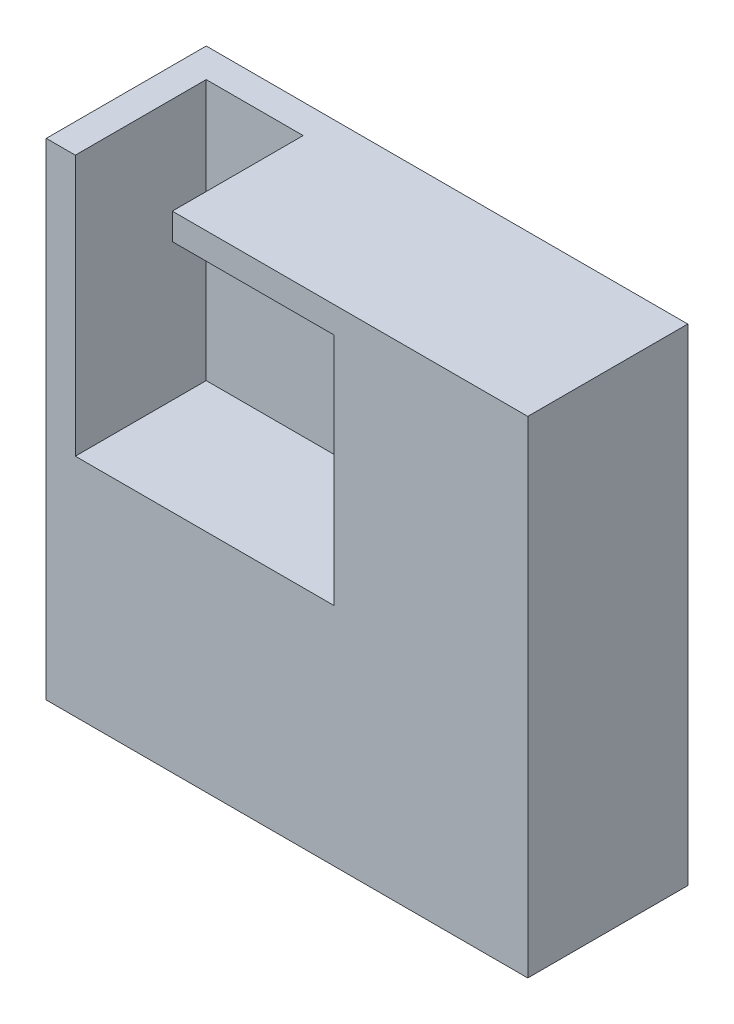
ISO-10303-21;
HEADER;
FILE_DESCRIPTION(('STEP AP214'),'2;1');
FILE_NAME('part.step','',(''),(''),'','','');
FILE_SCHEMA(('AUTOMOTIVE_DESIGN { 1 0 10303 214 1 1 1 1 }'));
ENDSEC;
DATA;
#1=APPLICATION_CONTEXT('core data for automotive mechanical design processes');
#2=APPLICATION_PROTOCOL_DEFINITION('international standard','automotive_design',2000,#1);
#3=PRODUCT_CONTEXT('',#1,'mechanical');
#4=PRODUCT('Part','Part','',(#3));
#5=PRODUCT_RELATED_PRODUCT_CATEGORY('part','',(#4));
#6=PRODUCT_DEFINITION_FORMATION('','',#4);
#7=PRODUCT_DEFINITION_CONTEXT('part definition',#1,'design');
#8=PRODUCT_DEFINITION('design','',#6,#7);
#9=PRODUCT_DEFINITION_SHAPE('','',#8);
#10=(LENGTH_UNIT() NAMED_UNIT(*) SI_UNIT(.MILLI.,.METRE.));
#11=(NAMED_UNIT(*) PLANE_ANGLE_UNIT() SI_UNIT($,.RADIAN.));
#12=(NAMED_UNIT(*) SI_UNIT($,.STERADIAN.) SOLID_ANGLE_UNIT());
#13=UNCERTAINTY_MEASURE_WITH_UNIT(LENGTH_MEASURE(1.E-05),#10,'distance_accuracy_value','');
#14=(GEOMETRIC_REPRESENTATION_CONTEXT(3) GLOBAL_UNCERTAINTY_ASSIGNED_CONTEXT((#13)) GLOBAL_UNIT_ASSIGNED_CONTEXT((#10,
#11,#12)) REPRESENTATION_CONTEXT('',''));
#15=CARTESIAN_POINT('',(0.,0.,0.));
#16=DIRECTION('',(0.,0.,1.));
#17=DIRECTION('',(1.,0.,0.));
#18=AXIS2_PLACEMENT_3D('',#15,#16,#17);
#19=CARTESIAN_POINT('',(0.,0.,9.9));
#20=DIRECTION('',(1.,0.,0.));
#21=DIRECTION('',(0.,1.,0.));
#22=AXIS2_PLACEMENT_3D('',#19,#20,#21);
#23=PLANE('',#22);
#24=DIRECTION('',(0.,-1.,0.));
#25=VECTOR('',#24,1.);
#26=CARTESIAN_POINT('',(0.,0.,0.));
#27=LINE('',#26,#25);
#28=CARTESIAN_POINT('',(0.,30.1,0.));
#29=VERTEX_POINT('',#28);
#30=CARTESIAN_POINT('',(0.,0.,0.));
#31=VERTEX_POINT('',#30);
#32=EDGE_CURVE('E183',#29,#31,#27,.T.);
#33=ORIENTED_EDGE('',*,*,#32,.T.);
#34=DIRECTION('',(0.,0.,-1.));
#35=VECTOR('',#34,1.);
#36=CARTESIAN_POINT('',(0.,0.,9.9));
#37=LINE('',#36,#35);
#38=CARTESIAN_POINT('',(0.,0.,9.9));
#39=VERTEX_POINT('',#38);
#40=EDGE_CURVE('E11',#39,#31,#37,.T.);
#41=ORIENTED_EDGE('',*,*,#40,.F.);
#42=DIRECTION('',(0.,-1.,0.));
#43=VECTOR('',#42,1.);
#44=CARTESIAN_POINT('',(0.,0.,9.9));
#45=LINE('',#44,#43);
#46=CARTESIAN_POINT('',(0.,30.1,9.9));
#47=VERTEX_POINT('',#46);
#48=EDGE_CURVE('E196',#47,#39,#45,.T.);
#49=ORIENTED_EDGE('',*,*,#48,.F.);
#50=DIRECTION('',(0.,0.,-1.));
#51=VECTOR('',#50,1.);
#52=CARTESIAN_POINT('',(0.,30.1,9.9));
#53=LINE('',#52,#51);
#54=EDGE_CURVE('E208',#47,#29,#53,.T.);
#55=ORIENTED_EDGE('',*,*,#54,.T.);
#56=EDGE_LOOP('',(#33,#41,#49,#55));
#57=FACE_BOUND('',#56,.T.);
#58=ADVANCED_FACE('F39',(#57),#23,.F.);
#59=CARTESIAN_POINT('',(0.,0.,9.9));
#60=DIRECTION('',(0.,1.,0.));
#61=DIRECTION('',(0.,0.,1.));
#62=AXIS2_PLACEMENT_3D('',#59,#60,#61);
#63=PLANE('',#62);
#64=DIRECTION('',(1.,0.,0.));
#65=VECTOR('',#64,1.);
#66=CARTESIAN_POINT('',(0.,0.,0.));
#67=LINE('',#66,#65);
#68=CARTESIAN_POINT('',(29.8,0.,0.));
#69=VERTEX_POINT('',#68);
#70=EDGE_CURVE('E212',#31,#69,#67,.T.);
#71=ORIENTED_EDGE('',*,*,#70,.T.);
#72=DIRECTION('',(0.,0.,-1.));
#73=VECTOR('',#72,1.);
#74=CARTESIAN_POINT('',(29.8,0.,9.9));
#75=LINE('',#74,#73);
#76=CARTESIAN_POINT('',(29.8,0.,9.9));
#77=VERTEX_POINT('',#76);
#78=EDGE_CURVE('E47',#77,#69,#75,.T.);
#79=ORIENTED_EDGE('',*,*,#78,.F.);
#80=DIRECTION('',(1.,0.,0.));
#81=VECTOR('',#80,1.);
#82=CARTESIAN_POINT('',(0.,0.,9.9));
#83=LINE('',#82,#81);
#84=EDGE_CURVE('E91',#39,#77,#83,.T.);
#85=ORIENTED_EDGE('',*,*,#84,.F.);
#86=ORIENTED_EDGE('',*,*,#40,.T.);
#87=EDGE_LOOP('',(#71,#79,#85,#86));
#88=FACE_BOUND('',#87,.T.);
#89=ADVANCED_FACE('F261',(#88),#63,.F.);
#90=CARTESIAN_POINT('',(29.8,0.,9.9));
#91=DIRECTION('',(-1.,0.,0.));
#92=DIRECTION('',(0.,-1.,0.));
#93=AXIS2_PLACEMENT_3D('',#90,#91,#92);
#94=PLANE('',#93);
#95=DIRECTION('',(0.,1.,0.));
#96=VECTOR('',#95,1.);
#97=CARTESIAN_POINT('',(29.8,0.,0.));
#98=LINE('',#97,#96);
#99=CARTESIAN_POINT('',(29.8,30.1,0.));
#100=VERTEX_POINT('',#99);
#101=EDGE_CURVE('E215',#69,#100,#98,.T.);
#102=ORIENTED_EDGE('',*,*,#101,.T.);
#103=DIRECTION('',(0.,0.,-1.));
#104=VECTOR('',#103,1.);
#105=CARTESIAN_POINT('',(29.8,30.1,9.9));
#106=LINE('',#105,#104);
#107=CARTESIAN_POINT('',(29.8,30.1,9.9));
#108=VERTEX_POINT('',#107);
#109=EDGE_CURVE('E222',#108,#100,#106,.T.);
#110=ORIENTED_EDGE('',*,*,#109,.F.);
#111=DIRECTION('',(0.,1.,0.));
#112=VECTOR('',#111,1.);
#113=CARTESIAN_POINT('',(29.8,0.,9.9));
#114=LINE('',#113,#112);
#115=EDGE_CURVE('E201',#77,#108,#114,.T.);
#116=ORIENTED_EDGE('',*,*,#115,.F.);
#117=ORIENTED_EDGE('',*,*,#78,.T.);
#118=EDGE_LOOP('',(#102,#110,#116,#117));
#119=FACE_BOUND('',#118,.T.);
#120=ADVANCED_FACE('F229',(#119),#94,.F.);
#121=CARTESIAN_POINT('',(0.,30.1,9.9));
#122=DIRECTION('',(0.,-1.,0.));
#123=DIRECTION('',(0.,0.,-1.));
#124=AXIS2_PLACEMENT_3D('',#121,#122,#123);
#125=PLANE('',#124);
#126=DIRECTION('',(-1.,0.,0.));
#127=VECTOR('',#126,1.);
#128=CARTESIAN_POINT('',(1.79999999999999,30.1,1.8));
#129=LINE('',#128,#127);
#130=CARTESIAN_POINT('',(7.79999999999999,30.1,1.8));
#131=VERTEX_POINT('',#130);
#132=CARTESIAN_POINT('',(1.79999999999999,30.1,1.8));
#133=VERTEX_POINT('',#132);
#134=EDGE_CURVE('E134',#131,#133,#129,.T.);
#135=ORIENTED_EDGE('',*,*,#134,.F.);
#136=DIRECTION('',(0.,0.,1.));
#137=VECTOR('',#136,1.);
#138=CARTESIAN_POINT('',(7.79999999999999,30.1,1.8));
#139=LINE('',#138,#137);
#140=CARTESIAN_POINT('',(7.79999999999999,30.1,9.9));
#141=VERTEX_POINT('',#140);
#142=EDGE_CURVE('E184',#131,#141,#139,.T.);
#143=ORIENTED_EDGE('',*,*,#142,.T.);
#144=DIRECTION('',(-1.,0.,0.));
#145=VECTOR('',#144,1.);
#146=CARTESIAN_POINT('',(0.,30.1,9.9));
#147=LINE('',#146,#145);
#148=EDGE_CURVE('E204',#108,#141,#147,.T.);
#149=ORIENTED_EDGE('',*,*,#148,.F.);
#150=ORIENTED_EDGE('',*,*,#109,.T.);
#151=DIRECTION('',(-1.,0.,0.));
#152=VECTOR('',#151,1.);
#153=CARTESIAN_POINT('',(0.,30.1,0.));
#154=LINE('',#153,#152);
#155=EDGE_CURVE('E84',#100,#29,#154,.T.);
#156=ORIENTED_EDGE('',*,*,#155,.T.);
#157=ORIENTED_EDGE('',*,*,#54,.F.);
#158=CARTESIAN_POINT('',(1.79999999999999,30.1,9.9));
#159=VERTEX_POINT('',#158);
#160=EDGE_CURVE('E62',#159,#47,#147,.T.);
#161=ORIENTED_EDGE('',*,*,#160,.F.);
#162=DIRECTION('',(0.,0.,1.));
#163=VECTOR('',#162,1.);
#164=CARTESIAN_POINT('',(1.79999999999999,30.1,1.8));
#165=LINE('',#164,#163);
#166=EDGE_CURVE('E54',#133,#159,#165,.T.);
#167=ORIENTED_EDGE('',*,*,#166,.F.);
#168=EDGE_LOOP('',(#135,#143,#149,#150,#156,#157,#161,#167));
#169=FACE_BOUND('',#168,.T.);
#170=ADVANCED_FACE('F237',(#169),#125,.F.);
#171=CARTESIAN_POINT('',(0.,0.,9.9));
#172=DIRECTION('',(0.,0.,-1.));
#173=DIRECTION('',(-1.,0.,0.));
#174=AXIS2_PLACEMENT_3D('',#171,#172,#173);
#175=PLANE('',#174);
#176=ORIENTED_EDGE('',*,*,#148,.T.);
#177=DIRECTION('',(0.,1.,0.));
#178=VECTOR('',#177,1.);
#179=CARTESIAN_POINT('',(7.79999999999999,30.1,9.9));
#180=LINE('',#179,#178);
#181=CARTESIAN_POINT('',(7.79999999999999,28.4669153740142,9.9));
#182=VERTEX_POINT('',#181);
#183=EDGE_CURVE('E136',#182,#141,#180,.T.);
#184=ORIENTED_EDGE('',*,*,#183,.F.);
#185=DIRECTION('',(-1.,0.,0.));
#186=VECTOR('',#185,1.);
#187=CARTESIAN_POINT('',(7.79999999999999,28.4669153740142,9.9));
#188=LINE('',#187,#186);
#189=CARTESIAN_POINT('',(17.8,28.4669153740142,9.9));
#190=VERTEX_POINT('',#189);
#191=EDGE_CURVE('E175',#190,#182,#188,.T.);
#192=ORIENTED_EDGE('',*,*,#191,.F.);
#193=DIRECTION('',(0.,1.,0.));
#194=VECTOR('',#193,1.);
#195=CARTESIAN_POINT('',(17.8,28.4669153740142,9.9));
#196=LINE('',#195,#194);
#197=CARTESIAN_POINT('',(17.8,13.9669153740142,9.9));
#198=VERTEX_POINT('',#197);
#199=EDGE_CURVE('E171',#198,#190,#196,.T.);
#200=ORIENTED_EDGE('',*,*,#199,.F.);
#201=DIRECTION('',(1.,0.,0.));
#202=VECTOR('',#201,1.);
#203=CARTESIAN_POINT('',(1.79999999999999,13.9669153740142,9.9));
#204=LINE('',#203,#202);
#205=CARTESIAN_POINT('',(1.79999999999999,13.9669153740142,9.9));
#206=VERTEX_POINT('',#205);
#207=EDGE_CURVE('E167',#206,#198,#204,.T.);
#208=ORIENTED_EDGE('',*,*,#207,.F.);
#209=DIRECTION('',(0.,-1.,0.));
#210=VECTOR('',#209,1.);
#211=CARTESIAN_POINT('',(1.79999999999999,28.4669153740142,9.9));
#212=LINE('',#211,#210);
#213=EDGE_CURVE('E140',#159,#206,#212,.T.);
#214=ORIENTED_EDGE('',*,*,#213,.F.);
#215=ORIENTED_EDGE('',*,*,#160,.T.);
#216=ORIENTED_EDGE('',*,*,#48,.T.);
#217=ORIENTED_EDGE('',*,*,#84,.T.);
#218=ORIENTED_EDGE('',*,*,#115,.T.);
#219=EDGE_LOOP('',(#176,#184,#192,#200,#208,#214,#215,#216,#217,#218));
#220=FACE_BOUND('',#219,.T.);
#221=ADVANCED_FACE('F243',(#220),#175,.F.);
#222=CARTESIAN_POINT('',(0.,0.,0.));
#223=DIRECTION('',(0.,0.,-1.));
#224=DIRECTION('',(-1.,0.,0.));
#225=AXIS2_PLACEMENT_3D('',#222,#223,#224);
#226=PLANE('',#225);
#227=CARTESIAN_POINT('',(14.3,17.4669153740142,0.));
#228=DIRECTION('',(0.,0.,1.));
#229=DIRECTION('',(1.,0.,0.));
#230=AXIS2_PLACEMENT_3D('',#227,#228,#229);
#231=CIRCLE('',#230,2.8);
#232=CARTESIAN_POINT('',(17.1,17.4669153740142,0.));
#233=VERTEX_POINT('',#232);
#234=EDGE_CURVE('E168',#233,#233,#231,.T.);
#235=ORIENTED_EDGE('',*,*,#234,.T.);
#236=EDGE_LOOP('',(#235));
#237=FACE_BOUND('',#236,.T.);
#238=ORIENTED_EDGE('',*,*,#32,.F.);
#239=ORIENTED_EDGE('',*,*,#155,.F.);
#240=ORIENTED_EDGE('',*,*,#101,.F.);
#241=ORIENTED_EDGE('',*,*,#70,.F.);
#242=EDGE_LOOP('',(#238,#239,#240,#241));
#243=FACE_BOUND('',#242,.T.);
#244=ADVANCED_FACE('F233',(#237,#243),#226,.T.);
#245=CARTESIAN_POINT('',(7.79999999999999,30.1,1.8));
#246=DIRECTION('',(1.,0.,0.));
#247=DIRECTION('',(0.,0.,-1.));
#248=AXIS2_PLACEMENT_3D('',#245,#246,#247);
#249=PLANE('',#248);
#250=ORIENTED_EDGE('',*,*,#183,.T.);
#251=ORIENTED_EDGE('',*,*,#142,.F.);
#252=DIRECTION('',(0.,1.,0.));
#253=VECTOR('',#252,1.);
#254=CARTESIAN_POINT('',(7.79999999999999,30.1,1.8));
#255=LINE('',#254,#253);
#256=CARTESIAN_POINT('',(7.79999999999999,28.4669153740142,1.8));
#257=VERTEX_POINT('',#256);
#258=EDGE_CURVE('E160',#257,#131,#255,.T.);
#259=ORIENTED_EDGE('',*,*,#258,.F.);
#260=DIRECTION('',(0.,0.,1.));
#261=VECTOR('',#260,1.);
#262=CARTESIAN_POINT('',(7.79999999999999,28.4669153740142,1.8));
#263=LINE('',#262,#261);
#264=EDGE_CURVE('E188',#257,#182,#263,.T.);
#265=ORIENTED_EDGE('',*,*,#264,.T.);
#266=EDGE_LOOP('',(#250,#251,#259,#265));
#267=FACE_BOUND('',#266,.T.);
#268=ADVANCED_FACE('F246',(#267),#249,.F.);
#269=CARTESIAN_POINT('',(7.79999999999999,28.4669153740142,1.8));
#270=DIRECTION('',(0.,1.,0.));
#271=DIRECTION('',(0.,0.,1.));
#272=AXIS2_PLACEMENT_3D('',#269,#270,#271);
#273=PLANE('',#272);
#274=ORIENTED_EDGE('',*,*,#191,.T.);
#275=ORIENTED_EDGE('',*,*,#264,.F.);
#276=DIRECTION('',(-1.,0.,0.));
#277=VECTOR('',#276,1.);
#278=CARTESIAN_POINT('',(7.79999999999999,28.4669153740142,1.8));
#279=LINE('',#278,#277);
#280=CARTESIAN_POINT('',(17.8,28.4669153740142,1.8));
#281=VERTEX_POINT('',#280);
#282=EDGE_CURVE('E153',#281,#257,#279,.T.);
#283=ORIENTED_EDGE('',*,*,#282,.F.);
#284=DIRECTION('',(0.,0.,1.));
#285=VECTOR('',#284,1.);
#286=CARTESIAN_POINT('',(17.8,28.4669153740142,1.8));
#287=LINE('',#286,#285);
#288=EDGE_CURVE('E191',#281,#190,#287,.T.);
#289=ORIENTED_EDGE('',*,*,#288,.T.);
#290=EDGE_LOOP('',(#274,#275,#283,#289));
#291=FACE_BOUND('',#290,.T.);
#292=ADVANCED_FACE('F249',(#291),#273,.F.);
#293=CARTESIAN_POINT('',(17.8,28.4669153740142,1.8));
#294=DIRECTION('',(1.,0.,0.));
#295=DIRECTION('',(0.,1.,0.));
#296=AXIS2_PLACEMENT_3D('',#293,#294,#295);
#297=PLANE('',#296);
#298=ORIENTED_EDGE('',*,*,#199,.T.);
#299=ORIENTED_EDGE('',*,*,#288,.F.);
#300=DIRECTION('',(0.,1.,0.));
#301=VECTOR('',#300,1.);
#302=CARTESIAN_POINT('',(17.8,28.4669153740142,1.8));
#303=LINE('',#302,#301);
#304=CARTESIAN_POINT('',(17.8,13.9669153740142,1.8));
#305=VERTEX_POINT('',#304);
#306=EDGE_CURVE('E150',#305,#281,#303,.T.);
#307=ORIENTED_EDGE('',*,*,#306,.F.);
#308=DIRECTION('',(0.,0.,1.));
#309=VECTOR('',#308,1.);
#310=CARTESIAN_POINT('',(17.8,13.9669153740142,1.8));
#311=LINE('',#310,#309);
#312=EDGE_CURVE('E145',#305,#198,#311,.T.);
#313=ORIENTED_EDGE('',*,*,#312,.T.);
#314=EDGE_LOOP('',(#298,#299,#307,#313));
#315=FACE_BOUND('',#314,.T.);
#316=ADVANCED_FACE('F251',(#315),#297,.F.);
#317=CARTESIAN_POINT('',(1.79999999999999,13.9669153740142,1.8));
#318=DIRECTION('',(0.,-1.,0.));
#319=DIRECTION('',(0.,0.,-1.));
#320=AXIS2_PLACEMENT_3D('',#317,#318,#319);
#321=PLANE('',#320);
#322=ORIENTED_EDGE('',*,*,#207,.T.);
#323=ORIENTED_EDGE('',*,*,#312,.F.);
#324=DIRECTION('',(1.,0.,0.));
#325=VECTOR('',#324,1.);
#326=CARTESIAN_POINT('',(1.79999999999999,13.9669153740142,1.8));
#327=LINE('',#326,#325);
#328=CARTESIAN_POINT('',(1.79999999999999,13.9669153740142,1.8));
#329=VERTEX_POINT('',#328);
#330=EDGE_CURVE('E131',#329,#305,#327,.T.);
#331=ORIENTED_EDGE('',*,*,#330,.F.);
#332=DIRECTION('',(0.,0.,1.));
#333=VECTOR('',#332,1.);
#334=CARTESIAN_POINT('',(1.79999999999999,13.9669153740142,1.8));
#335=LINE('',#334,#333);
#336=EDGE_CURVE('E138',#329,#206,#335,.T.);
#337=ORIENTED_EDGE('',*,*,#336,.T.);
#338=EDGE_LOOP('',(#322,#323,#331,#337));
#339=FACE_BOUND('',#338,.T.);
#340=ADVANCED_FACE('F147',(#339),#321,.F.);
#341=CARTESIAN_POINT('',(1.79999999999999,28.4669153740142,1.8));
#342=DIRECTION('',(-1.,0.,0.));
#343=DIRECTION('',(0.,-1.,0.));
#344=AXIS2_PLACEMENT_3D('',#341,#342,#343);
#345=PLANE('',#344);
#346=ORIENTED_EDGE('',*,*,#213,.T.);
#347=ORIENTED_EDGE('',*,*,#336,.F.);
#348=DIRECTION('',(0.,-1.,0.));
#349=VECTOR('',#348,1.);
#350=CARTESIAN_POINT('',(1.79999999999999,28.4669153740142,1.8));
#351=LINE('',#350,#349);
#352=EDGE_CURVE('E126',#133,#329,#351,.T.);
#353=ORIENTED_EDGE('',*,*,#352,.F.);
#354=ORIENTED_EDGE('',*,*,#166,.T.);
#355=EDGE_LOOP('',(#346,#347,#353,#354));
#356=FACE_BOUND('',#355,.T.);
#357=ADVANCED_FACE('F139',(#356),#345,.F.);
#358=CARTESIAN_POINT('',(0.,0.,1.8));
#359=DIRECTION('',(0.,0.,-1.));
#360=DIRECTION('',(-1.,0.,0.));
#361=AXIS2_PLACEMENT_3D('',#358,#359,#360);
#362=PLANE('',#361);
#363=CARTESIAN_POINT('',(14.3,17.4669153740142,1.8));
#364=DIRECTION('',(0.,0.,1.));
#365=DIRECTION('',(1.,0.,0.));
#366=AXIS2_PLACEMENT_3D('',#363,#364,#365);
#367=CIRCLE('',#366,2.8);
#368=CARTESIAN_POINT('',(17.1,17.4669153740142,1.8));
#369=VERTEX_POINT('',#368);
#370=EDGE_CURVE('E364',#369,#369,#367,.T.);
#371=ORIENTED_EDGE('',*,*,#370,.F.);
#372=EDGE_LOOP('',(#371));
#373=FACE_BOUND('',#372,.T.);
#374=ORIENTED_EDGE('',*,*,#352,.T.);
#375=ORIENTED_EDGE('',*,*,#330,.T.);
#376=ORIENTED_EDGE('',*,*,#306,.T.);
#377=ORIENTED_EDGE('',*,*,#282,.T.);
#378=ORIENTED_EDGE('',*,*,#258,.T.);
#379=ORIENTED_EDGE('',*,*,#134,.T.);
#380=EDGE_LOOP('',(#374,#375,#376,#377,#378,#379));
#381=FACE_BOUND('',#380,.T.);
#382=ADVANCED_FACE('F128',(#373,#381),#362,.F.);
#383=CARTESIAN_POINT('',(14.3,17.4669153740142,0.));
#384=DIRECTION('',(0.,0.,1.));
#385=DIRECTION('',(1.,0.,0.));
#386=AXIS2_PLACEMENT_3D('',#383,#384,#385);
#387=CYLINDRICAL_SURFACE('',#386,2.8);
#388=ORIENTED_EDGE('',*,*,#234,.F.);
#389=EDGE_LOOP('',(#388));
#390=FACE_BOUND('',#389,.T.);
#391=ORIENTED_EDGE('',*,*,#370,.T.);
#392=EDGE_LOOP('',(#391));
#393=FACE_BOUND('',#392,.T.);
#394=ADVANCED_FACE('F281',(#390,#393),#387,.F.);
#395=CLOSED_SHELL('',(#58,#89,#120,#170,#221,#244,#268,#292,#316,#340,#357,#382,#394));
#396=MANIFOLD_SOLID_BREP('B2',#395);
#397=ADVANCED_BREP_SHAPE_REPRESENTATION('',(#18,#396),#14);
#398=SHAPE_DEFINITION_REPRESENTATION(#9,#397);
ENDSEC;
END-ISO-10303-21;
